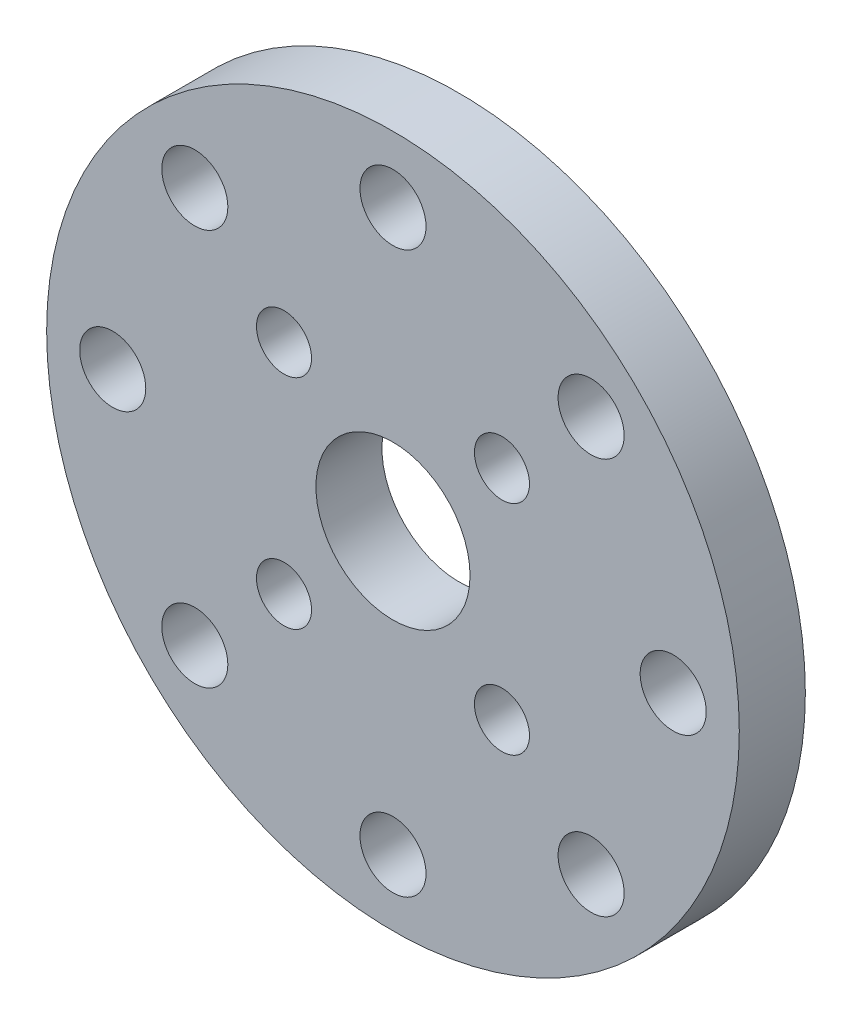
ISO-10303-21;
HEADER;
FILE_DESCRIPTION(('STEP AP214'),'2;1');
FILE_NAME('part.step','',(''),(''),'','','');
FILE_SCHEMA(('AUTOMOTIVE_DESIGN { 1 0 10303 214 1 1 1 1 }'));
ENDSEC;
DATA;
#1=APPLICATION_CONTEXT('core data for automotive mechanical design processes');
#2=APPLICATION_PROTOCOL_DEFINITION('international standard','automotive_design',2000,#1);
#3=PRODUCT_CONTEXT('',#1,'mechanical');
#4=PRODUCT('Part','Part','',(#3));
#5=PRODUCT_RELATED_PRODUCT_CATEGORY('part','',(#4));
#6=PRODUCT_DEFINITION_FORMATION('','',#4);
#7=PRODUCT_DEFINITION_CONTEXT('part definition',#1,'design');
#8=PRODUCT_DEFINITION('design','',#6,#7);
#9=PRODUCT_DEFINITION_SHAPE('','',#8);
#10=(LENGTH_UNIT() NAMED_UNIT(*) SI_UNIT(.MILLI.,.METRE.));
#11=(NAMED_UNIT(*) PLANE_ANGLE_UNIT() SI_UNIT($,.RADIAN.));
#12=(NAMED_UNIT(*) SI_UNIT($,.STERADIAN.) SOLID_ANGLE_UNIT());
#13=UNCERTAINTY_MEASURE_WITH_UNIT(LENGTH_MEASURE(1.E-05),#10,'distance_accuracy_value','');
#14=(GEOMETRIC_REPRESENTATION_CONTEXT(3) GLOBAL_UNCERTAINTY_ASSIGNED_CONTEXT((#13)) GLOBAL_UNIT_ASSIGNED_CONTEXT((#10,
#11,#12)) REPRESENTATION_CONTEXT('',''));
#15=CARTESIAN_POINT('',(0.,0.,0.));
#16=DIRECTION('',(0.,0.,1.));
#17=DIRECTION('',(1.,0.,0.));
#18=AXIS2_PLACEMENT_3D('',#15,#16,#17);
#19=CARTESIAN_POINT('',(20.2464004909,284.5474762058,3.));
#20=DIRECTION('',(0.,0.,1.));
#21=DIRECTION('',(1.,0.,0.));
#22=AXIS2_PLACEMENT_3D('',#19,#20,#21);
#23=PLANE('',#22);
#24=CARTESIAN_POINT('',(29.2464004909,275.5474762058,3.));
#25=DIRECTION('',(0.,0.,1.));
#26=DIRECTION('',(1.,0.,0.));
#27=AXIS2_PLACEMENT_3D('',#24,#25,#26);
#28=CIRCLE('',#27,1.5);
#29=CARTESIAN_POINT('',(30.7464004909,275.5474762058,3.));
#30=VERTEX_POINT('',#29);
#31=EDGE_CURVE('E107',#30,#30,#28,.T.);
#32=ORIENTED_EDGE('',*,*,#31,.F.);
#33=EDGE_LOOP('',(#32));
#34=FACE_BOUND('',#33,.T.);
#35=CARTESIAN_POINT('',(11.2464004909,293.5474762058,3.));
#36=DIRECTION('',(0.,0.,1.));
#37=DIRECTION('',(1.,0.,0.));
#38=AXIS2_PLACEMENT_3D('',#35,#36,#37);
#39=CIRCLE('',#38,1.5);
#40=CARTESIAN_POINT('',(12.7464004909,293.5474762058,3.));
#41=VERTEX_POINT('',#40);
#42=EDGE_CURVE('E95',#41,#41,#39,.T.);
#43=ORIENTED_EDGE('',*,*,#42,.F.);
#44=EDGE_LOOP('',(#43));
#45=FACE_BOUND('',#44,.T.);
#46=CARTESIAN_POINT('',(25.1961479592,289.4972236741,3.));
#47=DIRECTION('',(0.,0.,1.));
#48=DIRECTION('',(1.,0.,0.));
#49=AXIS2_PLACEMENT_3D('',#46,#47,#48);
#50=CIRCLE('',#49,1.25);
#51=CARTESIAN_POINT('',(26.4461479592,289.4972236741,3.));
#52=VERTEX_POINT('',#51);
#53=EDGE_CURVE('E83',#52,#52,#50,.T.);
#54=ORIENTED_EDGE('',*,*,#53,.F.);
#55=EDGE_LOOP('',(#54));
#56=FACE_BOUND('',#55,.T.);
#57=CARTESIAN_POINT('',(15.2966530226,279.5977287375,3.));
#58=DIRECTION('',(0.,0.,1.));
#59=DIRECTION('',(1.,0.,0.));
#60=AXIS2_PLACEMENT_3D('',#57,#58,#59);
#61=CIRCLE('',#60,1.25);
#62=CARTESIAN_POINT('',(16.5466530226,279.5977287375,3.));
#63=VERTEX_POINT('',#62);
#64=EDGE_CURVE('E71',#63,#63,#61,.T.);
#65=ORIENTED_EDGE('',*,*,#64,.F.);
#66=EDGE_LOOP('',(#65));
#67=FACE_BOUND('',#66,.T.);
#68=CARTESIAN_POINT('',(32.9743225523,284.5474762058,3.));
#69=DIRECTION('',(0.,0.,1.));
#70=DIRECTION('',(1.,0.,0.));
#71=AXIS2_PLACEMENT_3D('',#68,#69,#70);
#72=CIRCLE('',#71,1.5);
#73=CARTESIAN_POINT('',(34.4743225523,284.5474762058,3.));
#74=VERTEX_POINT('',#73);
#75=EDGE_CURVE('E59',#74,#74,#72,.T.);
#76=ORIENTED_EDGE('',*,*,#75,.F.);
#77=EDGE_LOOP('',(#76));
#78=FACE_BOUND('',#77,.T.);
#79=CARTESIAN_POINT('',(7.5184784296,284.5474762058,3.));
#80=DIRECTION('',(0.,0.,1.));
#81=DIRECTION('',(1.,0.,0.));
#82=AXIS2_PLACEMENT_3D('',#79,#80,#81);
#83=CIRCLE('',#82,1.5);
#84=CARTESIAN_POINT('',(9.0184784296,284.5474762058,3.));
#85=VERTEX_POINT('',#84);
#86=EDGE_CURVE('E47',#85,#85,#83,.T.);
#87=ORIENTED_EDGE('',*,*,#86,.F.);
#88=EDGE_LOOP('',(#87));
#89=FACE_BOUND('',#88,.T.);
#90=CARTESIAN_POINT('',(20.2464004909,284.5474762058,3.));
#91=DIRECTION('',(0.,0.,1.));
#92=DIRECTION('',(1.,0.,0.));
#93=AXIS2_PLACEMENT_3D('',#90,#91,#92);
#94=CIRCLE('',#93,15.73);
#95=CARTESIAN_POINT('',(35.9764004909,284.5474762058,3.));
#96=VERTEX_POINT('',#95);
#97=EDGE_CURVE('E10',#96,#96,#94,.T.);
#98=ORIENTED_EDGE('',*,*,#97,.T.);
#99=EDGE_LOOP('',(#98));
#100=FACE_BOUND('',#99,.T.);
#101=CARTESIAN_POINT('',(20.2464004909,297.2753982672,3.));
#102=DIRECTION('',(0.,0.,1.));
#103=DIRECTION('',(1.,0.,0.));
#104=AXIS2_PLACEMENT_3D('',#101,#102,#103);
#105=CIRCLE('',#104,1.5);
#106=CARTESIAN_POINT('',(21.7464004909,297.2753982672,3.));
#107=VERTEX_POINT('',#106);
#108=EDGE_CURVE('E42',#107,#107,#105,.T.);
#109=ORIENTED_EDGE('',*,*,#108,.F.);
#110=EDGE_LOOP('',(#109));
#111=FACE_BOUND('',#110,.T.);
#112=CARTESIAN_POINT('',(20.2464004909,271.8195541444,3.));
#113=DIRECTION('',(0.,0.,1.));
#114=DIRECTION('',(1.,0.,0.));
#115=AXIS2_PLACEMENT_3D('',#112,#113,#114);
#116=CIRCLE('',#115,1.5);
#117=CARTESIAN_POINT('',(21.7464004909,271.8195541444,3.));
#118=VERTEX_POINT('',#117);
#119=EDGE_CURVE('E53',#118,#118,#116,.T.);
#120=ORIENTED_EDGE('',*,*,#119,.F.);
#121=EDGE_LOOP('',(#120));
#122=FACE_BOUND('',#121,.T.);
#123=CARTESIAN_POINT('',(15.2966530226,289.4972236741,3.));
#124=DIRECTION('',(0.,0.,1.));
#125=DIRECTION('',(1.,0.,0.));
#126=AXIS2_PLACEMENT_3D('',#123,#124,#125);
#127=CIRCLE('',#126,1.25);
#128=CARTESIAN_POINT('',(16.5466530226,289.4972236741,3.));
#129=VERTEX_POINT('',#128);
#130=EDGE_CURVE('E65',#129,#129,#127,.T.);
#131=ORIENTED_EDGE('',*,*,#130,.F.);
#132=EDGE_LOOP('',(#131));
#133=FACE_BOUND('',#132,.T.);
#134=CARTESIAN_POINT('',(25.1961479592,279.5977287375,3.));
#135=DIRECTION('',(0.,0.,1.));
#136=DIRECTION('',(1.,0.,0.));
#137=AXIS2_PLACEMENT_3D('',#134,#135,#136);
#138=CIRCLE('',#137,1.25);
#139=CARTESIAN_POINT('',(26.4461479592,279.5977287375,3.));
#140=VERTEX_POINT('',#139);
#141=EDGE_CURVE('E77',#140,#140,#138,.T.);
#142=ORIENTED_EDGE('',*,*,#141,.F.);
#143=EDGE_LOOP('',(#142));
#144=FACE_BOUND('',#143,.T.);
#145=CARTESIAN_POINT('',(20.2464004909,284.5474762058,3.));
#146=DIRECTION('',(0.,0.,1.));
#147=DIRECTION('',(1.,0.,0.));
#148=AXIS2_PLACEMENT_3D('',#145,#146,#147);
#149=CIRCLE('',#148,3.5);
#150=CARTESIAN_POINT('',(23.7464004909,284.5474762058,3.));
#151=VERTEX_POINT('',#150);
#152=EDGE_CURVE('E89',#151,#151,#149,.T.);
#153=ORIENTED_EDGE('',*,*,#152,.F.);
#154=EDGE_LOOP('',(#153));
#155=FACE_BOUND('',#154,.T.);
#156=CARTESIAN_POINT('',(11.2464004909,275.5474762058,3.));
#157=DIRECTION('',(0.,0.,1.));
#158=DIRECTION('',(1.,0.,0.));
#159=AXIS2_PLACEMENT_3D('',#156,#157,#158);
#160=CIRCLE('',#159,1.5);
#161=CARTESIAN_POINT('',(12.7464004909,275.5474762058,3.));
#162=VERTEX_POINT('',#161);
#163=EDGE_CURVE('E101',#162,#162,#160,.T.);
#164=ORIENTED_EDGE('',*,*,#163,.F.);
#165=EDGE_LOOP('',(#164));
#166=FACE_BOUND('',#165,.T.);
#167=CARTESIAN_POINT('',(29.2464004909,293.5474762058,3.));
#168=DIRECTION('',(0.,0.,1.));
#169=DIRECTION('',(1.,0.,0.));
#170=AXIS2_PLACEMENT_3D('',#167,#168,#169);
#171=CIRCLE('',#170,1.5);
#172=CARTESIAN_POINT('',(30.7464004909,293.5474762058,3.));
#173=VERTEX_POINT('',#172);
#174=EDGE_CURVE('E113',#173,#173,#171,.T.);
#175=ORIENTED_EDGE('',*,*,#174,.F.);
#176=EDGE_LOOP('',(#175));
#177=FACE_BOUND('',#176,.T.);
#178=ADVANCED_FACE('F31',(#34,#45,#56,#67,#78,#89,#100,#111,#122,#133,#144,#155,#166,#177),#23,.T.);
#179=CARTESIAN_POINT('',(20.2464004909,284.5474762058,0.));
#180=DIRECTION('',(0.,0.,1.));
#181=DIRECTION('',(1.,0.,0.));
#182=AXIS2_PLACEMENT_3D('',#179,#180,#181);
#183=PLANE('',#182);
#184=CARTESIAN_POINT('',(29.2464004909,275.5474762058,0.));
#185=DIRECTION('',(0.,0.,1.));
#186=DIRECTION('',(1.,0.,0.));
#187=AXIS2_PLACEMENT_3D('',#184,#185,#186);
#188=CIRCLE('',#187,1.5);
#189=CARTESIAN_POINT('',(30.7464004909,275.5474762058,0.));
#190=VERTEX_POINT('',#189);
#191=EDGE_CURVE('E110',#190,#190,#188,.T.);
#192=ORIENTED_EDGE('',*,*,#191,.T.);
#193=EDGE_LOOP('',(#192));
#194=FACE_BOUND('',#193,.T.);
#195=CARTESIAN_POINT('',(11.2464004909,293.5474762058,0.));
#196=DIRECTION('',(0.,0.,1.));
#197=DIRECTION('',(1.,0.,0.));
#198=AXIS2_PLACEMENT_3D('',#195,#196,#197);
#199=CIRCLE('',#198,1.5);
#200=CARTESIAN_POINT('',(12.7464004909,293.5474762058,0.));
#201=VERTEX_POINT('',#200);
#202=EDGE_CURVE('E98',#201,#201,#199,.T.);
#203=ORIENTED_EDGE('',*,*,#202,.T.);
#204=EDGE_LOOP('',(#203));
#205=FACE_BOUND('',#204,.T.);
#206=CARTESIAN_POINT('',(25.1961479592,289.4972236741,0.));
#207=DIRECTION('',(0.,0.,1.));
#208=DIRECTION('',(1.,0.,0.));
#209=AXIS2_PLACEMENT_3D('',#206,#207,#208);
#210=CIRCLE('',#209,1.25);
#211=CARTESIAN_POINT('',(26.4461479592,289.4972236741,0.));
#212=VERTEX_POINT('',#211);
#213=EDGE_CURVE('E86',#212,#212,#210,.T.);
#214=ORIENTED_EDGE('',*,*,#213,.T.);
#215=EDGE_LOOP('',(#214));
#216=FACE_BOUND('',#215,.T.);
#217=CARTESIAN_POINT('',(15.2966530226,279.5977287375,0.));
#218=DIRECTION('',(0.,0.,1.));
#219=DIRECTION('',(1.,0.,0.));
#220=AXIS2_PLACEMENT_3D('',#217,#218,#219);
#221=CIRCLE('',#220,1.25);
#222=CARTESIAN_POINT('',(16.5466530226,279.5977287375,0.));
#223=VERTEX_POINT('',#222);
#224=EDGE_CURVE('E74',#223,#223,#221,.T.);
#225=ORIENTED_EDGE('',*,*,#224,.T.);
#226=EDGE_LOOP('',(#225));
#227=FACE_BOUND('',#226,.T.);
#228=CARTESIAN_POINT('',(32.9743225523,284.5474762058,0.));
#229=DIRECTION('',(0.,0.,1.));
#230=DIRECTION('',(1.,0.,0.));
#231=AXIS2_PLACEMENT_3D('',#228,#229,#230);
#232=CIRCLE('',#231,1.5);
#233=CARTESIAN_POINT('',(34.4743225523,284.5474762058,0.));
#234=VERTEX_POINT('',#233);
#235=EDGE_CURVE('E62',#234,#234,#232,.T.);
#236=ORIENTED_EDGE('',*,*,#235,.T.);
#237=EDGE_LOOP('',(#236));
#238=FACE_BOUND('',#237,.T.);
#239=CARTESIAN_POINT('',(7.5184784296,284.5474762058,0.));
#240=DIRECTION('',(0.,0.,1.));
#241=DIRECTION('',(1.,0.,0.));
#242=AXIS2_PLACEMENT_3D('',#239,#240,#241);
#243=CIRCLE('',#242,1.5);
#244=CARTESIAN_POINT('',(9.0184784296,284.5474762058,0.));
#245=VERTEX_POINT('',#244);
#246=EDGE_CURVE('E50',#245,#245,#243,.T.);
#247=ORIENTED_EDGE('',*,*,#246,.T.);
#248=EDGE_LOOP('',(#247));
#249=FACE_BOUND('',#248,.T.);
#250=CARTESIAN_POINT('',(20.2464004909,284.5474762058,0.));
#251=DIRECTION('',(0.,0.,1.));
#252=DIRECTION('',(1.,0.,0.));
#253=AXIS2_PLACEMENT_3D('',#250,#251,#252);
#254=CIRCLE('',#253,15.73);
#255=CARTESIAN_POINT('',(35.9764004909,284.5474762058,0.));
#256=VERTEX_POINT('',#255);
#257=EDGE_CURVE('E35',#256,#256,#254,.T.);
#258=ORIENTED_EDGE('',*,*,#257,.F.);
#259=EDGE_LOOP('',(#258));
#260=FACE_BOUND('',#259,.T.);
#261=CARTESIAN_POINT('',(20.2464004909,297.2753982672,0.));
#262=DIRECTION('',(0.,0.,1.));
#263=DIRECTION('',(1.,0.,0.));
#264=AXIS2_PLACEMENT_3D('',#261,#262,#263);
#265=CIRCLE('',#264,1.5);
#266=CARTESIAN_POINT('',(21.7464004909,297.2753982672,0.));
#267=VERTEX_POINT('',#266);
#268=EDGE_CURVE('E44',#267,#267,#265,.T.);
#269=ORIENTED_EDGE('',*,*,#268,.T.);
#270=EDGE_LOOP('',(#269));
#271=FACE_BOUND('',#270,.T.);
#272=CARTESIAN_POINT('',(20.2464004909,271.8195541444,0.));
#273=DIRECTION('',(0.,0.,1.));
#274=DIRECTION('',(1.,0.,0.));
#275=AXIS2_PLACEMENT_3D('',#272,#273,#274);
#276=CIRCLE('',#275,1.5);
#277=CARTESIAN_POINT('',(21.7464004909,271.8195541444,0.));
#278=VERTEX_POINT('',#277);
#279=EDGE_CURVE('E56',#278,#278,#276,.T.);
#280=ORIENTED_EDGE('',*,*,#279,.T.);
#281=EDGE_LOOP('',(#280));
#282=FACE_BOUND('',#281,.T.);
#283=CARTESIAN_POINT('',(15.2966530226,289.4972236741,0.));
#284=DIRECTION('',(0.,0.,1.));
#285=DIRECTION('',(1.,0.,0.));
#286=AXIS2_PLACEMENT_3D('',#283,#284,#285);
#287=CIRCLE('',#286,1.25);
#288=CARTESIAN_POINT('',(16.5466530226,289.4972236741,0.));
#289=VERTEX_POINT('',#288);
#290=EDGE_CURVE('E68',#289,#289,#287,.T.);
#291=ORIENTED_EDGE('',*,*,#290,.T.);
#292=EDGE_LOOP('',(#291));
#293=FACE_BOUND('',#292,.T.);
#294=CARTESIAN_POINT('',(25.1961479592,279.5977287375,0.));
#295=DIRECTION('',(0.,0.,1.));
#296=DIRECTION('',(1.,0.,0.));
#297=AXIS2_PLACEMENT_3D('',#294,#295,#296);
#298=CIRCLE('',#297,1.25);
#299=CARTESIAN_POINT('',(26.4461479592,279.5977287375,0.));
#300=VERTEX_POINT('',#299);
#301=EDGE_CURVE('E80',#300,#300,#298,.T.);
#302=ORIENTED_EDGE('',*,*,#301,.T.);
#303=EDGE_LOOP('',(#302));
#304=FACE_BOUND('',#303,.T.);
#305=CARTESIAN_POINT('',(20.2464004909,284.5474762058,0.));
#306=DIRECTION('',(0.,0.,1.));
#307=DIRECTION('',(1.,0.,0.));
#308=AXIS2_PLACEMENT_3D('',#305,#306,#307);
#309=CIRCLE('',#308,3.5);
#310=CARTESIAN_POINT('',(23.7464004909,284.5474762058,0.));
#311=VERTEX_POINT('',#310);
#312=EDGE_CURVE('E92',#311,#311,#309,.T.);
#313=ORIENTED_EDGE('',*,*,#312,.T.);
#314=EDGE_LOOP('',(#313));
#315=FACE_BOUND('',#314,.T.);
#316=CARTESIAN_POINT('',(11.2464004909,275.5474762058,0.));
#317=DIRECTION('',(0.,0.,1.));
#318=DIRECTION('',(1.,0.,0.));
#319=AXIS2_PLACEMENT_3D('',#316,#317,#318);
#320=CIRCLE('',#319,1.5);
#321=CARTESIAN_POINT('',(12.7464004909,275.5474762058,0.));
#322=VERTEX_POINT('',#321);
#323=EDGE_CURVE('E104',#322,#322,#320,.T.);
#324=ORIENTED_EDGE('',*,*,#323,.T.);
#325=EDGE_LOOP('',(#324));
#326=FACE_BOUND('',#325,.T.);
#327=CARTESIAN_POINT('',(29.2464004909,293.5474762058,0.));
#328=DIRECTION('',(0.,0.,1.));
#329=DIRECTION('',(1.,0.,0.));
#330=AXIS2_PLACEMENT_3D('',#327,#328,#329);
#331=CIRCLE('',#330,1.5);
#332=CARTESIAN_POINT('',(30.7464004909,293.5474762058,0.));
#333=VERTEX_POINT('',#332);
#334=EDGE_CURVE('E116',#333,#333,#331,.T.);
#335=ORIENTED_EDGE('',*,*,#334,.T.);
#336=EDGE_LOOP('',(#335));
#337=FACE_BOUND('',#336,.T.);
#338=ADVANCED_FACE('F126',(#194,#205,#216,#227,#238,#249,#260,#271,#282,#293,#304,#315,#326,
#337),#183,.F.);
#339=CARTESIAN_POINT('',(20.2464004909,284.5474762058,3.));
#340=DIRECTION('',(0.,0.,-1.));
#341=DIRECTION('',(-1.,0.,0.));
#342=AXIS2_PLACEMENT_3D('',#339,#340,#341);
#343=CYLINDRICAL_SURFACE('',#342,15.73);
#344=ORIENTED_EDGE('',*,*,#97,.F.);
#345=EDGE_LOOP('',(#344));
#346=FACE_BOUND('',#345,.T.);
#347=ORIENTED_EDGE('',*,*,#257,.T.);
#348=EDGE_LOOP('',(#347));
#349=FACE_BOUND('',#348,.T.);
#350=ADVANCED_FACE('F33',(#346,#349),#343,.T.);
#351=CARTESIAN_POINT('',(20.2464004909,297.2753982672,3.));
#352=DIRECTION('',(0.,0.,-1.));
#353=DIRECTION('',(-1.,0.,0.));
#354=AXIS2_PLACEMENT_3D('',#351,#352,#353);
#355=CYLINDRICAL_SURFACE('',#354,1.5);
#356=ORIENTED_EDGE('',*,*,#108,.T.);
#357=EDGE_LOOP('',(#356));
#358=FACE_BOUND('',#357,.T.);
#359=ORIENTED_EDGE('',*,*,#268,.F.);
#360=EDGE_LOOP('',(#359));
#361=FACE_BOUND('',#360,.T.);
#362=ADVANCED_FACE('F136',(#358,#361),#355,.F.);
#363=CARTESIAN_POINT('',(7.5184784296,284.5474762058,3.));
#364=DIRECTION('',(0.,0.,-1.));
#365=DIRECTION('',(-1.,0.,0.));
#366=AXIS2_PLACEMENT_3D('',#363,#364,#365);
#367=CYLINDRICAL_SURFACE('',#366,1.5);
#368=ORIENTED_EDGE('',*,*,#86,.T.);
#369=EDGE_LOOP('',(#368));
#370=FACE_BOUND('',#369,.T.);
#371=ORIENTED_EDGE('',*,*,#246,.F.);
#372=EDGE_LOOP('',(#371));
#373=FACE_BOUND('',#372,.T.);
#374=ADVANCED_FACE('F139',(#370,#373),#367,.F.);
#375=CARTESIAN_POINT('',(20.2464004909,271.8195541444,3.));
#376=DIRECTION('',(0.,0.,-1.));
#377=DIRECTION('',(-1.,0.,0.));
#378=AXIS2_PLACEMENT_3D('',#375,#376,#377);
#379=CYLINDRICAL_SURFACE('',#378,1.5);
#380=ORIENTED_EDGE('',*,*,#119,.T.);
#381=EDGE_LOOP('',(#380));
#382=FACE_BOUND('',#381,.T.);
#383=ORIENTED_EDGE('',*,*,#279,.F.);
#384=EDGE_LOOP('',(#383));
#385=FACE_BOUND('',#384,.T.);
#386=ADVANCED_FACE('F143',(#382,#385),#379,.F.);
#387=CARTESIAN_POINT('',(32.9743225523,284.5474762058,3.));
#388=DIRECTION('',(0.,0.,-1.));
#389=DIRECTION('',(-1.,0.,0.));
#390=AXIS2_PLACEMENT_3D('',#387,#388,#389);
#391=CYLINDRICAL_SURFACE('',#390,1.5);
#392=ORIENTED_EDGE('',*,*,#75,.T.);
#393=EDGE_LOOP('',(#392));
#394=FACE_BOUND('',#393,.T.);
#395=ORIENTED_EDGE('',*,*,#235,.F.);
#396=EDGE_LOOP('',(#395));
#397=FACE_BOUND('',#396,.T.);
#398=ADVANCED_FACE('F147',(#394,#397),#391,.F.);
#399=CARTESIAN_POINT('',(15.2966530226,289.4972236741,3.));
#400=DIRECTION('',(0.,0.,-1.));
#401=DIRECTION('',(-1.,0.,0.));
#402=AXIS2_PLACEMENT_3D('',#399,#400,#401);
#403=CYLINDRICAL_SURFACE('',#402,1.25);
#404=ORIENTED_EDGE('',*,*,#130,.T.);
#405=EDGE_LOOP('',(#404));
#406=FACE_BOUND('',#405,.T.);
#407=ORIENTED_EDGE('',*,*,#290,.F.);
#408=EDGE_LOOP('',(#407));
#409=FACE_BOUND('',#408,.T.);
#410=ADVANCED_FACE('F151',(#406,#409),#403,.F.);
#411=CARTESIAN_POINT('',(15.2966530226,279.5977287375,3.));
#412=DIRECTION('',(0.,0.,-1.));
#413=DIRECTION('',(-1.,0.,0.));
#414=AXIS2_PLACEMENT_3D('',#411,#412,#413);
#415=CYLINDRICAL_SURFACE('',#414,1.25);
#416=ORIENTED_EDGE('',*,*,#64,.T.);
#417=EDGE_LOOP('',(#416));
#418=FACE_BOUND('',#417,.T.);
#419=ORIENTED_EDGE('',*,*,#224,.F.);
#420=EDGE_LOOP('',(#419));
#421=FACE_BOUND('',#420,.T.);
#422=ADVANCED_FACE('F155',(#418,#421),#415,.F.);
#423=CARTESIAN_POINT('',(25.1961479592,279.5977287375,3.));
#424=DIRECTION('',(0.,0.,-1.));
#425=DIRECTION('',(-1.,0.,0.));
#426=AXIS2_PLACEMENT_3D('',#423,#424,#425);
#427=CYLINDRICAL_SURFACE('',#426,1.25);
#428=ORIENTED_EDGE('',*,*,#141,.T.);
#429=EDGE_LOOP('',(#428));
#430=FACE_BOUND('',#429,.T.);
#431=ORIENTED_EDGE('',*,*,#301,.F.);
#432=EDGE_LOOP('',(#431));
#433=FACE_BOUND('',#432,.T.);
#434=ADVANCED_FACE('F159',(#430,#433),#427,.F.);
#435=CARTESIAN_POINT('',(25.1961479592,289.4972236741,3.));
#436=DIRECTION('',(0.,0.,-1.));
#437=DIRECTION('',(-1.,0.,0.));
#438=AXIS2_PLACEMENT_3D('',#435,#436,#437);
#439=CYLINDRICAL_SURFACE('',#438,1.25);
#440=ORIENTED_EDGE('',*,*,#53,.T.);
#441=EDGE_LOOP('',(#440));
#442=FACE_BOUND('',#441,.T.);
#443=ORIENTED_EDGE('',*,*,#213,.F.);
#444=EDGE_LOOP('',(#443));
#445=FACE_BOUND('',#444,.T.);
#446=ADVANCED_FACE('F163',(#442,#445),#439,.F.);
#447=CARTESIAN_POINT('',(20.2464004909,284.5474762058,3.));
#448=DIRECTION('',(0.,0.,-1.));
#449=DIRECTION('',(-1.,0.,0.));
#450=AXIS2_PLACEMENT_3D('',#447,#448,#449);
#451=CYLINDRICAL_SURFACE('',#450,3.5);
#452=ORIENTED_EDGE('',*,*,#152,.T.);
#453=EDGE_LOOP('',(#452));
#454=FACE_BOUND('',#453,.T.);
#455=ORIENTED_EDGE('',*,*,#312,.F.);
#456=EDGE_LOOP('',(#455));
#457=FACE_BOUND('',#456,.T.);
#458=ADVANCED_FACE('F167',(#454,#457),#451,.F.);
#459=CARTESIAN_POINT('',(11.2464004909,293.5474762058,3.));
#460=DIRECTION('',(0.,0.,-1.));
#461=DIRECTION('',(-1.,0.,0.));
#462=AXIS2_PLACEMENT_3D('',#459,#460,#461);
#463=CYLINDRICAL_SURFACE('',#462,1.5);
#464=ORIENTED_EDGE('',*,*,#42,.T.);
#465=EDGE_LOOP('',(#464));
#466=FACE_BOUND('',#465,.T.);
#467=ORIENTED_EDGE('',*,*,#202,.F.);
#468=EDGE_LOOP('',(#467));
#469=FACE_BOUND('',#468,.T.);
#470=ADVANCED_FACE('F171',(#466,#469),#463,.F.);
#471=CARTESIAN_POINT('',(11.2464004909,275.5474762058,3.));
#472=DIRECTION('',(0.,0.,-1.));
#473=DIRECTION('',(-1.,0.,0.));
#474=AXIS2_PLACEMENT_3D('',#471,#472,#473);
#475=CYLINDRICAL_SURFACE('',#474,1.5);
#476=ORIENTED_EDGE('',*,*,#163,.T.);
#477=EDGE_LOOP('',(#476));
#478=FACE_BOUND('',#477,.T.);
#479=ORIENTED_EDGE('',*,*,#323,.F.);
#480=EDGE_LOOP('',(#479));
#481=FACE_BOUND('',#480,.T.);
#482=ADVANCED_FACE('F175',(#478,#481),#475,.F.);
#483=CARTESIAN_POINT('',(29.2464004909,275.5474762058,3.));
#484=DIRECTION('',(0.,0.,-1.));
#485=DIRECTION('',(-1.,0.,0.));
#486=AXIS2_PLACEMENT_3D('',#483,#484,#485);
#487=CYLINDRICAL_SURFACE('',#486,1.5);
#488=ORIENTED_EDGE('',*,*,#31,.T.);
#489=EDGE_LOOP('',(#488));
#490=FACE_BOUND('',#489,.T.);
#491=ORIENTED_EDGE('',*,*,#191,.F.);
#492=EDGE_LOOP('',(#491));
#493=FACE_BOUND('',#492,.T.);
#494=ADVANCED_FACE('F179',(#490,#493),#487,.F.);
#495=CARTESIAN_POINT('',(29.2464004909,293.5474762058,3.));
#496=DIRECTION('',(0.,0.,-1.));
#497=DIRECTION('',(-1.,0.,0.));
#498=AXIS2_PLACEMENT_3D('',#495,#496,#497);
#499=CYLINDRICAL_SURFACE('',#498,1.5);
#500=ORIENTED_EDGE('',*,*,#174,.T.);
#501=EDGE_LOOP('',(#500));
#502=FACE_BOUND('',#501,.T.);
#503=ORIENTED_EDGE('',*,*,#334,.F.);
#504=EDGE_LOOP('',(#503));
#505=FACE_BOUND('',#504,.T.);
#506=ADVANCED_FACE('F122',(#502,#505),#499,.F.);
#507=CLOSED_SHELL('',(#178,#338,#350,#362,#374,#386,#398,#410,#422,#434,#446,#458,#470,#482,
#494,#506));
#508=MANIFOLD_SOLID_BREP('B2',#507);
#509=ADVANCED_BREP_SHAPE_REPRESENTATION('',(#18,#508),#14);
#510=SHAPE_DEFINITION_REPRESENTATION(#9,#509);
ENDSEC;
END-ISO-10303-21;
